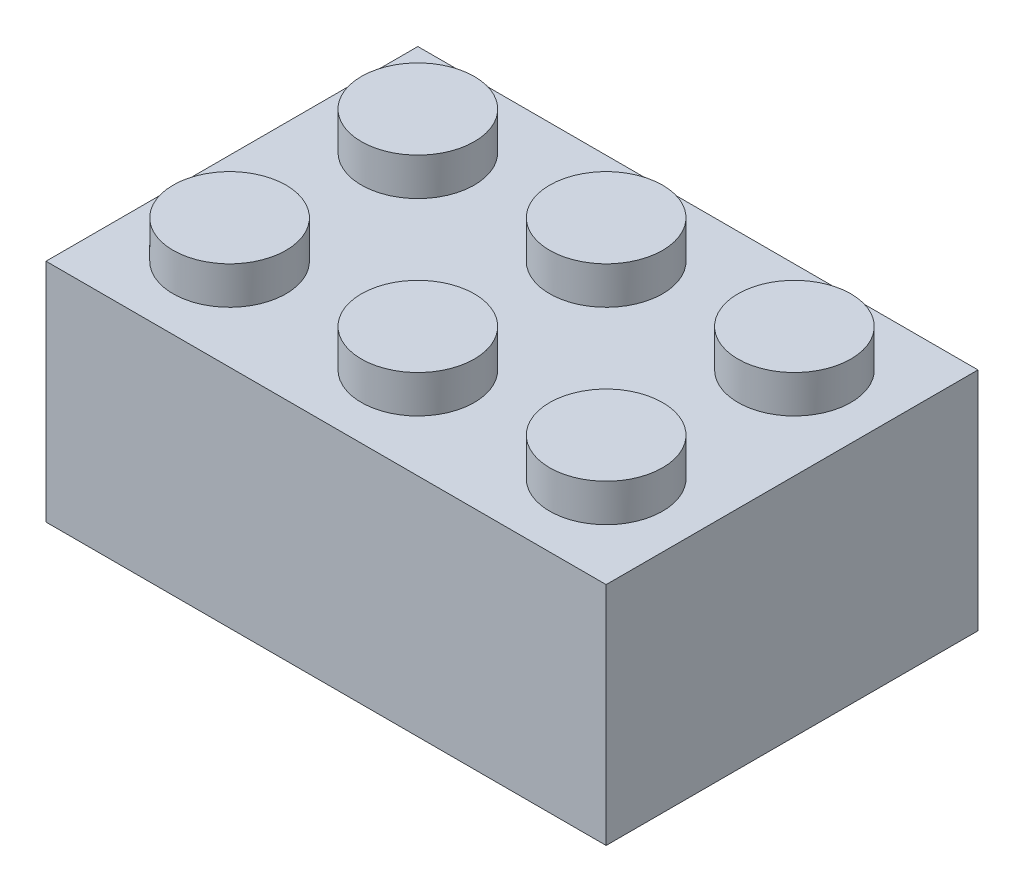
ISO-10303-21;
HEADER;
FILE_DESCRIPTION(('STEP AP214'),'2;1');
FILE_NAME('part.step','',(''),(''),'','','');
FILE_SCHEMA(('AUTOMOTIVE_DESIGN { 1 0 10303 214 1 1 1 1 }'));
ENDSEC;
DATA;
#1=APPLICATION_CONTEXT('core data for automotive mechanical design processes');
#2=APPLICATION_PROTOCOL_DEFINITION('international standard','automotive_design',2000,#1);
#3=PRODUCT_CONTEXT('',#1,'mechanical');
#4=PRODUCT('Part','Part','',(#3));
#5=PRODUCT_RELATED_PRODUCT_CATEGORY('part','',(#4));
#6=PRODUCT_DEFINITION_FORMATION('','',#4);
#7=PRODUCT_DEFINITION_CONTEXT('part definition',#1,'design');
#8=PRODUCT_DEFINITION('design','',#6,#7);
#9=PRODUCT_DEFINITION_SHAPE('','',#8);
#10=(LENGTH_UNIT() NAMED_UNIT(*) SI_UNIT(.MILLI.,.METRE.));
#11=(NAMED_UNIT(*) PLANE_ANGLE_UNIT() SI_UNIT($,.RADIAN.));
#12=(NAMED_UNIT(*) SI_UNIT($,.STERADIAN.) SOLID_ANGLE_UNIT());
#13=UNCERTAINTY_MEASURE_WITH_UNIT(LENGTH_MEASURE(1.E-05),#10,'distance_accuracy_value','');
#14=(GEOMETRIC_REPRESENTATION_CONTEXT(3) GLOBAL_UNCERTAINTY_ASSIGNED_CONTEXT((#13)) GLOBAL_UNIT_ASSIGNED_CONTEXT((#10,
#11,#12)) REPRESENTATION_CONTEXT('',''));
#15=CARTESIAN_POINT('',(0.,0.,0.));
#16=DIRECTION('',(0.,0.,1.));
#17=DIRECTION('',(1.,0.,0.));
#18=AXIS2_PLACEMENT_3D('',#15,#16,#17);
#19=CARTESIAN_POINT('',(0.,0.,-15.8));
#20=DIRECTION('',(0.,-1.,0.));
#21=DIRECTION('',(0.,0.,-1.));
#22=AXIS2_PLACEMENT_3D('',#19,#20,#21);
#23=PLANE('',#22);
#24=DIRECTION('',(1.,0.,0.));
#25=VECTOR('',#24,1.);
#26=CARTESIAN_POINT('',(0.,0.,0.));
#27=LINE('',#26,#25);
#28=CARTESIAN_POINT('',(0.,0.,0.));
#29=VERTEX_POINT('',#28);
#30=CARTESIAN_POINT('',(23.8,0.,0.));
#31=VERTEX_POINT('',#30);
#32=EDGE_CURVE('E183',#29,#31,#27,.T.);
#33=ORIENTED_EDGE('',*,*,#32,.F.);
#34=DIRECTION('',(0.,0.,1.));
#35=VECTOR('',#34,1.);
#36=CARTESIAN_POINT('',(0.,0.,-15.8));
#37=LINE('',#36,#35);
#38=CARTESIAN_POINT('',(0.,0.,-15.8));
#39=VERTEX_POINT('',#38);
#40=EDGE_CURVE('E188',#39,#29,#37,.T.);
#41=ORIENTED_EDGE('',*,*,#40,.F.);
#42=DIRECTION('',(1.,0.,0.));
#43=VECTOR('',#42,1.);
#44=CARTESIAN_POINT('',(0.,0.,-15.8));
#45=LINE('',#44,#43);
#46=CARTESIAN_POINT('',(23.8,0.,-15.8));
#47=VERTEX_POINT('',#46);
#48=EDGE_CURVE('E173',#39,#47,#45,.T.);
#49=ORIENTED_EDGE('',*,*,#48,.T.);
#50=DIRECTION('',(0.,0.,1.));
#51=VECTOR('',#50,1.);
#52=CARTESIAN_POINT('',(23.8,0.,-15.8));
#53=LINE('',#52,#51);
#54=EDGE_CURVE('E190',#47,#31,#53,.T.);
#55=ORIENTED_EDGE('',*,*,#54,.T.);
#56=EDGE_LOOP('',(#33,#41,#49,#55));
#57=FACE_BOUND('',#56,.T.);
#58=DIRECTION('',(0.,0.,1.));
#59=VECTOR('',#58,1.);
#60=CARTESIAN_POINT('',(1.2,0.,-15.8));
#61=LINE('',#60,#59);
#62=CARTESIAN_POINT('',(1.2,0.,-14.6));
#63=VERTEX_POINT('',#62);
#64=CARTESIAN_POINT('',(1.2,0.,-1.2));
#65=VERTEX_POINT('',#64);
#66=EDGE_CURVE('E156',#63,#65,#61,.T.);
#67=ORIENTED_EDGE('',*,*,#66,.T.);
#68=DIRECTION('',(1.,0.,0.));
#69=VECTOR('',#68,1.);
#70=CARTESIAN_POINT('',(0.,0.,-1.2));
#71=LINE('',#70,#69);
#72=CARTESIAN_POINT('',(22.6,0.,-1.2));
#73=VERTEX_POINT('',#72);
#74=EDGE_CURVE('E137',#65,#73,#71,.T.);
#75=ORIENTED_EDGE('',*,*,#74,.T.);
#76=DIRECTION('',(0.,0.,1.));
#77=VECTOR('',#76,1.);
#78=CARTESIAN_POINT('',(22.6,0.,-15.8));
#79=LINE('',#78,#77);
#80=CARTESIAN_POINT('',(22.6,0.,-14.6));
#81=VERTEX_POINT('',#80);
#82=EDGE_CURVE('E123',#81,#73,#79,.T.);
#83=ORIENTED_EDGE('',*,*,#82,.F.);
#84=DIRECTION('',(1.,0.,0.));
#85=VECTOR('',#84,1.);
#86=CARTESIAN_POINT('',(0.,0.,-14.6));
#87=LINE('',#86,#85);
#88=EDGE_CURVE('E51',#63,#81,#87,.T.);
#89=ORIENTED_EDGE('',*,*,#88,.F.);
#90=EDGE_LOOP('',(#67,#75,#83,#89));
#91=FACE_BOUND('',#90,.T.);
#92=ADVANCED_FACE('F36',(#57,#91),#23,.T.);
#93=CARTESIAN_POINT('',(19.9,11.2,-11.9));
#94=DIRECTION('',(0.,1.,0.));
#95=DIRECTION('',(0.,0.,1.));
#96=AXIS2_PLACEMENT_3D('',#93,#94,#95);
#97=PLANE('',#96);
#98=CARTESIAN_POINT('',(19.9,11.2,-11.9));
#99=DIRECTION('',(0.,1.,0.));
#100=DIRECTION('',(0.,0.,1.));
#101=AXIS2_PLACEMENT_3D('',#98,#99,#100);
#102=CIRCLE('',#101,2.4);
#103=CARTESIAN_POINT('',(19.9,11.2,-9.5));
#104=VERTEX_POINT('',#103);
#105=EDGE_CURVE('E221',#104,#104,#102,.T.);
#106=ORIENTED_EDGE('',*,*,#105,.T.);
#107=EDGE_LOOP('',(#106));
#108=FACE_BOUND('',#107,.T.);
#109=ADVANCED_FACE('F38',(#108),#97,.T.);
#110=CARTESIAN_POINT('',(19.9,11.2,-11.9));
#111=DIRECTION('',(0.,-1.,0.));
#112=DIRECTION('',(0.,0.,-1.));
#113=AXIS2_PLACEMENT_3D('',#110,#111,#112);
#114=CYLINDRICAL_SURFACE('',#113,2.4);
#115=ORIENTED_EDGE('',*,*,#105,.F.);
#116=EDGE_LOOP('',(#115));
#117=FACE_BOUND('',#116,.T.);
#118=CARTESIAN_POINT('',(19.9,9.6,-11.9));
#119=DIRECTION('',(0.,-1.,0.));
#120=DIRECTION('',(0.,0.,-1.));
#121=AXIS2_PLACEMENT_3D('',#118,#119,#120);
#122=CIRCLE('',#121,2.4);
#123=CARTESIAN_POINT('',(19.9,9.6,-14.3));
#124=VERTEX_POINT('',#123);
#125=EDGE_CURVE('E218',#124,#124,#122,.F.);
#126=ORIENTED_EDGE('',*,*,#125,.T.);
#127=EDGE_LOOP('',(#126));
#128=FACE_BOUND('',#127,.T.);
#129=ADVANCED_FACE('F258',(#117,#128),#114,.T.);
#130=CARTESIAN_POINT('',(11.9,11.2,-11.9));
#131=DIRECTION('',(0.,1.,0.));
#132=DIRECTION('',(0.,0.,1.));
#133=AXIS2_PLACEMENT_3D('',#130,#131,#132);
#134=PLANE('',#133);
#135=CARTESIAN_POINT('',(11.9,11.2,-11.9));
#136=DIRECTION('',(0.,1.,0.));
#137=DIRECTION('',(0.,0.,1.));
#138=AXIS2_PLACEMENT_3D('',#135,#136,#137);
#139=CIRCLE('',#138,2.4);
#140=CARTESIAN_POINT('',(11.9,11.2,-9.5));
#141=VERTEX_POINT('',#140);
#142=EDGE_CURVE('E215',#141,#141,#139,.T.);
#143=ORIENTED_EDGE('',*,*,#142,.T.);
#144=EDGE_LOOP('',(#143));
#145=FACE_BOUND('',#144,.T.);
#146=ADVANCED_FACE('F293',(#145),#134,.T.);
#147=CARTESIAN_POINT('',(11.9,11.2,-11.9));
#148=DIRECTION('',(0.,-1.,0.));
#149=DIRECTION('',(0.,0.,-1.));
#150=AXIS2_PLACEMENT_3D('',#147,#148,#149);
#151=CYLINDRICAL_SURFACE('',#150,2.4);
#152=ORIENTED_EDGE('',*,*,#142,.F.);
#153=EDGE_LOOP('',(#152));
#154=FACE_BOUND('',#153,.T.);
#155=CARTESIAN_POINT('',(11.9,9.6,-11.9));
#156=DIRECTION('',(0.,-1.,0.));
#157=DIRECTION('',(0.,0.,-1.));
#158=AXIS2_PLACEMENT_3D('',#155,#156,#157);
#159=CIRCLE('',#158,2.4);
#160=CARTESIAN_POINT('',(11.9,9.6,-14.3));
#161=VERTEX_POINT('',#160);
#162=EDGE_CURVE('E212',#161,#161,#159,.F.);
#163=ORIENTED_EDGE('',*,*,#162,.T.);
#164=EDGE_LOOP('',(#163));
#165=FACE_BOUND('',#164,.T.);
#166=ADVANCED_FACE('F289',(#154,#165),#151,.T.);
#167=CARTESIAN_POINT('',(3.9,11.2,-11.9));
#168=DIRECTION('',(0.,1.,0.));
#169=DIRECTION('',(0.,0.,1.));
#170=AXIS2_PLACEMENT_3D('',#167,#168,#169);
#171=PLANE('',#170);
#172=CARTESIAN_POINT('',(3.9,11.2,-11.9));
#173=DIRECTION('',(0.,1.,0.));
#174=DIRECTION('',(0.,0.,1.));
#175=AXIS2_PLACEMENT_3D('',#172,#173,#174);
#176=CIRCLE('',#175,2.4);
#177=CARTESIAN_POINT('',(3.9,11.2,-9.5));
#178=VERTEX_POINT('',#177);
#179=EDGE_CURVE('E209',#178,#178,#176,.T.);
#180=ORIENTED_EDGE('',*,*,#179,.T.);
#181=EDGE_LOOP('',(#180));
#182=FACE_BOUND('',#181,.T.);
#183=ADVANCED_FACE('F285',(#182),#171,.T.);
#184=CARTESIAN_POINT('',(3.9,11.2,-11.9));
#185=DIRECTION('',(0.,-1.,0.));
#186=DIRECTION('',(0.,0.,-1.));
#187=AXIS2_PLACEMENT_3D('',#184,#185,#186);
#188=CYLINDRICAL_SURFACE('',#187,2.4);
#189=ORIENTED_EDGE('',*,*,#179,.F.);
#190=EDGE_LOOP('',(#189));
#191=FACE_BOUND('',#190,.T.);
#192=CARTESIAN_POINT('',(3.9,9.6,-11.9));
#193=DIRECTION('',(0.,-1.,0.));
#194=DIRECTION('',(0.,0.,-1.));
#195=AXIS2_PLACEMENT_3D('',#192,#193,#194);
#196=CIRCLE('',#195,2.4);
#197=CARTESIAN_POINT('',(3.9,9.6,-14.3));
#198=VERTEX_POINT('',#197);
#199=EDGE_CURVE('E206',#198,#198,#196,.F.);
#200=ORIENTED_EDGE('',*,*,#199,.T.);
#201=EDGE_LOOP('',(#200));
#202=FACE_BOUND('',#201,.T.);
#203=ADVANCED_FACE('F281',(#191,#202),#188,.T.);
#204=CARTESIAN_POINT('',(19.9,11.2,-3.9));
#205=DIRECTION('',(0.,1.,0.));
#206=DIRECTION('',(0.,0.,1.));
#207=AXIS2_PLACEMENT_3D('',#204,#205,#206);
#208=PLANE('',#207);
#209=CARTESIAN_POINT('',(19.9,11.2,-3.9));
#210=DIRECTION('',(0.,1.,0.));
#211=DIRECTION('',(0.,0.,1.));
#212=AXIS2_PLACEMENT_3D('',#209,#210,#211);
#213=CIRCLE('',#212,2.4);
#214=CARTESIAN_POINT('',(19.9,11.2,-1.5));
#215=VERTEX_POINT('',#214);
#216=EDGE_CURVE('E203',#215,#215,#213,.T.);
#217=ORIENTED_EDGE('',*,*,#216,.T.);
#218=EDGE_LOOP('',(#217));
#219=FACE_BOUND('',#218,.T.);
#220=ADVANCED_FACE('F277',(#219),#208,.T.);
#221=CARTESIAN_POINT('',(19.9,11.2,-3.9));
#222=DIRECTION('',(0.,-1.,0.));
#223=DIRECTION('',(0.,0.,-1.));
#224=AXIS2_PLACEMENT_3D('',#221,#222,#223);
#225=CYLINDRICAL_SURFACE('',#224,2.4);
#226=ORIENTED_EDGE('',*,*,#216,.F.);
#227=EDGE_LOOP('',(#226));
#228=FACE_BOUND('',#227,.T.);
#229=CARTESIAN_POINT('',(19.9,9.6,-3.9));
#230=DIRECTION('',(0.,-1.,0.));
#231=DIRECTION('',(0.,0.,-1.));
#232=AXIS2_PLACEMENT_3D('',#229,#230,#231);
#233=CIRCLE('',#232,2.4);
#234=CARTESIAN_POINT('',(19.9,9.6,-6.3));
#235=VERTEX_POINT('',#234);
#236=EDGE_CURVE('E200',#235,#235,#233,.F.);
#237=ORIENTED_EDGE('',*,*,#236,.T.);
#238=EDGE_LOOP('',(#237));
#239=FACE_BOUND('',#238,.T.);
#240=ADVANCED_FACE('F273',(#228,#239),#225,.T.);
#241=CARTESIAN_POINT('',(0.,9.6,-15.8));
#242=DIRECTION('',(0.,-1.,0.));
#243=DIRECTION('',(0.,0.,-1.));
#244=AXIS2_PLACEMENT_3D('',#241,#242,#243);
#245=PLANE('',#244);
#246=CARTESIAN_POINT('',(11.9,9.6,-3.9));
#247=DIRECTION('',(0.,-1.,0.));
#248=DIRECTION('',(0.,0.,-1.));
#249=AXIS2_PLACEMENT_3D('',#246,#247,#248);
#250=CIRCLE('',#249,2.4);
#251=CARTESIAN_POINT('',(11.9,9.6,-6.3));
#252=VERTEX_POINT('',#251);
#253=EDGE_CURVE('E197',#252,#252,#250,.F.);
#254=ORIENTED_EDGE('',*,*,#253,.F.);
#255=EDGE_LOOP('',(#254));
#256=FACE_BOUND('',#255,.T.);
#257=CARTESIAN_POINT('',(3.9,9.6,-3.9));
#258=DIRECTION('',(0.,-1.,0.));
#259=DIRECTION('',(0.,0.,-1.));
#260=AXIS2_PLACEMENT_3D('',#257,#258,#259);
#261=CIRCLE('',#260,2.4);
#262=CARTESIAN_POINT('',(3.9,9.6,-6.3));
#263=VERTEX_POINT('',#262);
#264=EDGE_CURVE('E194',#263,#263,#261,.F.);
#265=ORIENTED_EDGE('',*,*,#264,.F.);
#266=EDGE_LOOP('',(#265));
#267=FACE_BOUND('',#266,.T.);
#268=DIRECTION('',(1.,0.,0.));
#269=VECTOR('',#268,1.);
#270=CARTESIAN_POINT('',(0.,9.6,0.));
#271=LINE('',#270,#269);
#272=CARTESIAN_POINT('',(0.,9.6,0.));
#273=VERTEX_POINT('',#272);
#274=CARTESIAN_POINT('',(23.8,9.6,0.));
#275=VERTEX_POINT('',#274);
#276=EDGE_CURVE('E168',#273,#275,#271,.T.);
#277=ORIENTED_EDGE('',*,*,#276,.T.);
#278=DIRECTION('',(0.,0.,1.));
#279=VECTOR('',#278,1.);
#280=CARTESIAN_POINT('',(23.8,9.6,-15.8));
#281=LINE('',#280,#279);
#282=CARTESIAN_POINT('',(23.8,9.6,-15.8));
#283=VERTEX_POINT('',#282);
#284=EDGE_CURVE('E192',#283,#275,#281,.T.);
#285=ORIENTED_EDGE('',*,*,#284,.F.);
#286=DIRECTION('',(1.,0.,0.));
#287=VECTOR('',#286,1.);
#288=CARTESIAN_POINT('',(0.,9.6,-15.8));
#289=LINE('',#288,#287);
#290=CARTESIAN_POINT('',(0.,9.6,-15.8));
#291=VERTEX_POINT('',#290);
#292=EDGE_CURVE('E86',#291,#283,#289,.T.);
#293=ORIENTED_EDGE('',*,*,#292,.F.);
#294=DIRECTION('',(0.,0.,1.));
#295=VECTOR('',#294,1.);
#296=CARTESIAN_POINT('',(0.,9.6,-15.8));
#297=LINE('',#296,#295);
#298=EDGE_CURVE('E177',#291,#273,#297,.T.);
#299=ORIENTED_EDGE('',*,*,#298,.T.);
#300=EDGE_LOOP('',(#277,#285,#293,#299));
#301=FACE_BOUND('',#300,.T.);
#302=ORIENTED_EDGE('',*,*,#236,.F.);
#303=EDGE_LOOP('',(#302));
#304=FACE_BOUND('',#303,.T.);
#305=ORIENTED_EDGE('',*,*,#199,.F.);
#306=EDGE_LOOP('',(#305));
#307=FACE_BOUND('',#306,.T.);
#308=ORIENTED_EDGE('',*,*,#162,.F.);
#309=EDGE_LOOP('',(#308));
#310=FACE_BOUND('',#309,.T.);
#311=ORIENTED_EDGE('',*,*,#125,.F.);
#312=EDGE_LOOP('',(#311));
#313=FACE_BOUND('',#312,.T.);
#314=ADVANCED_FACE('F269',(#256,#267,#301,#304,#307,#310,#313),#245,.F.);
#315=CARTESIAN_POINT('',(23.8,0.,-15.8));
#316=DIRECTION('',(1.,0.,0.));
#317=DIRECTION('',(0.,0.,-1.));
#318=AXIS2_PLACEMENT_3D('',#315,#316,#317);
#319=PLANE('',#318);
#320=DIRECTION('',(0.,1.,0.));
#321=VECTOR('',#320,1.);
#322=CARTESIAN_POINT('',(23.8,0.,0.));
#323=LINE('',#322,#321);
#324=EDGE_CURVE('E180',#31,#275,#323,.T.);
#325=ORIENTED_EDGE('',*,*,#324,.F.);
#326=ORIENTED_EDGE('',*,*,#54,.F.);
#327=DIRECTION('',(0.,1.,0.));
#328=VECTOR('',#327,1.);
#329=CARTESIAN_POINT('',(23.8,0.,-15.8));
#330=LINE('',#329,#328);
#331=EDGE_CURVE('E170',#47,#283,#330,.T.);
#332=ORIENTED_EDGE('',*,*,#331,.T.);
#333=ORIENTED_EDGE('',*,*,#284,.T.);
#334=EDGE_LOOP('',(#325,#326,#332,#333));
#335=FACE_BOUND('',#334,.T.);
#336=ADVANCED_FACE('F266',(#335),#319,.T.);
#337=CARTESIAN_POINT('',(0.,0.,-15.8));
#338=DIRECTION('',(1.,0.,0.));
#339=DIRECTION('',(0.,0.,-1.));
#340=AXIS2_PLACEMENT_3D('',#337,#338,#339);
#341=PLANE('',#340);
#342=DIRECTION('',(0.,1.,0.));
#343=VECTOR('',#342,1.);
#344=CARTESIAN_POINT('',(0.,0.,0.));
#345=LINE('',#344,#343);
#346=EDGE_CURVE('E81',#29,#273,#345,.T.);
#347=ORIENTED_EDGE('',*,*,#346,.T.);
#348=ORIENTED_EDGE('',*,*,#298,.F.);
#349=DIRECTION('',(0.,1.,0.));
#350=VECTOR('',#349,1.);
#351=CARTESIAN_POINT('',(0.,0.,-15.8));
#352=LINE('',#351,#350);
#353=EDGE_CURVE('E60',#39,#291,#352,.T.);
#354=ORIENTED_EDGE('',*,*,#353,.F.);
#355=ORIENTED_EDGE('',*,*,#40,.T.);
#356=EDGE_LOOP('',(#347,#348,#354,#355));
#357=FACE_BOUND('',#356,.T.);
#358=ADVANCED_FACE('F264',(#357),#341,.F.);
#359=CARTESIAN_POINT('',(0.,0.,-15.8));
#360=DIRECTION('',(0.,0.,1.));
#361=DIRECTION('',(1.,0.,0.));
#362=AXIS2_PLACEMENT_3D('',#359,#360,#361);
#363=PLANE('',#362);
#364=ORIENTED_EDGE('',*,*,#292,.T.);
#365=ORIENTED_EDGE('',*,*,#331,.F.);
#366=ORIENTED_EDGE('',*,*,#48,.F.);
#367=ORIENTED_EDGE('',*,*,#353,.T.);
#368=EDGE_LOOP('',(#364,#365,#366,#367));
#369=FACE_BOUND('',#368,.T.);
#370=ADVANCED_FACE('F346',(#369),#363,.F.);
#371=CARTESIAN_POINT('',(0.,0.,0.));
#372=DIRECTION('',(0.,0.,1.));
#373=DIRECTION('',(1.,0.,0.));
#374=AXIS2_PLACEMENT_3D('',#371,#372,#373);
#375=PLANE('',#374);
#376=ORIENTED_EDGE('',*,*,#276,.F.);
#377=ORIENTED_EDGE('',*,*,#346,.F.);
#378=ORIENTED_EDGE('',*,*,#32,.T.);
#379=ORIENTED_EDGE('',*,*,#324,.T.);
#380=EDGE_LOOP('',(#376,#377,#378,#379));
#381=FACE_BOUND('',#380,.T.);
#382=ADVANCED_FACE('F352',(#381),#375,.T.);
#383=CARTESIAN_POINT('',(3.9,11.2,-3.9));
#384=DIRECTION('',(0.,-1.,0.));
#385=DIRECTION('',(0.,0.,-1.));
#386=AXIS2_PLACEMENT_3D('',#383,#384,#385);
#387=CYLINDRICAL_SURFACE('',#386,2.4);
#388=CARTESIAN_POINT('',(3.9,11.2,-3.9));
#389=DIRECTION('',(0.,1.,0.));
#390=DIRECTION('',(0.,0.,1.));
#391=AXIS2_PLACEMENT_3D('',#388,#389,#390);
#392=CIRCLE('',#391,2.4);
#393=CARTESIAN_POINT('',(3.9,11.2,-1.5));
#394=VERTEX_POINT('',#393);
#395=EDGE_CURVE('E164',#394,#394,#392,.T.);
#396=ORIENTED_EDGE('',*,*,#395,.F.);
#397=EDGE_LOOP('',(#396));
#398=FACE_BOUND('',#397,.T.);
#399=ORIENTED_EDGE('',*,*,#264,.T.);
#400=EDGE_LOOP('',(#399));
#401=FACE_BOUND('',#400,.T.);
#402=ADVANCED_FACE('F359',(#398,#401),#387,.T.);
#403=CARTESIAN_POINT('',(3.9,11.2,-3.9));
#404=DIRECTION('',(0.,1.,0.));
#405=DIRECTION('',(0.,0.,1.));
#406=AXIS2_PLACEMENT_3D('',#403,#404,#405);
#407=PLANE('',#406);
#408=ORIENTED_EDGE('',*,*,#395,.T.);
#409=EDGE_LOOP('',(#408));
#410=FACE_BOUND('',#409,.T.);
#411=ADVANCED_FACE('F366',(#410),#407,.T.);
#412=CARTESIAN_POINT('',(11.9,11.2,-3.9));
#413=DIRECTION('',(0.,-1.,0.));
#414=DIRECTION('',(0.,0.,-1.));
#415=AXIS2_PLACEMENT_3D('',#412,#413,#414);
#416=CYLINDRICAL_SURFACE('',#415,2.4);
#417=CARTESIAN_POINT('',(11.9,11.2,-3.9));
#418=DIRECTION('',(0.,1.,0.));
#419=DIRECTION('',(0.,0.,1.));
#420=AXIS2_PLACEMENT_3D('',#417,#418,#419);
#421=CIRCLE('',#420,2.4);
#422=CARTESIAN_POINT('',(11.9,11.2,-1.5));
#423=VERTEX_POINT('',#422);
#424=EDGE_CURVE('E161',#423,#423,#421,.T.);
#425=ORIENTED_EDGE('',*,*,#424,.F.);
#426=EDGE_LOOP('',(#425));
#427=FACE_BOUND('',#426,.T.);
#428=ORIENTED_EDGE('',*,*,#253,.T.);
#429=EDGE_LOOP('',(#428));
#430=FACE_BOUND('',#429,.T.);
#431=ADVANCED_FACE('F374',(#427,#430),#416,.T.);
#432=CARTESIAN_POINT('',(11.9,11.2,-3.9));
#433=DIRECTION('',(0.,1.,0.));
#434=DIRECTION('',(0.,0.,1.));
#435=AXIS2_PLACEMENT_3D('',#432,#433,#434);
#436=PLANE('',#435);
#437=ORIENTED_EDGE('',*,*,#424,.T.);
#438=EDGE_LOOP('',(#437));
#439=FACE_BOUND('',#438,.T.);
#440=ADVANCED_FACE('F381',(#439),#436,.T.);
#441=CARTESIAN_POINT('',(19.9,10.,-11.9));
#442=DIRECTION('',(0.,1.,0.));
#443=DIRECTION('',(0.,0.,1.));
#444=AXIS2_PLACEMENT_3D('',#441,#442,#443);
#445=PLANE('',#444);
#446=CARTESIAN_POINT('',(19.9,10.,-11.9));
#447=DIRECTION('',(0.,1.,0.));
#448=DIRECTION('',(0.,0.,1.));
#449=AXIS2_PLACEMENT_3D('',#446,#447,#448);
#450=CIRCLE('',#449,1.2);
#451=CARTESIAN_POINT('',(19.9,10.,-10.7));
#452=VERTEX_POINT('',#451);
#453=EDGE_CURVE('E165',#452,#452,#450,.T.);
#454=ORIENTED_EDGE('',*,*,#453,.F.);
#455=EDGE_LOOP('',(#454));
#456=FACE_BOUND('',#455,.T.);
#457=ADVANCED_FACE('F389',(#456),#445,.F.);
#458=CARTESIAN_POINT('',(19.9,11.2,-11.9));
#459=DIRECTION('',(0.,-1.,0.));
#460=DIRECTION('',(0.,0.,-1.));
#461=AXIS2_PLACEMENT_3D('',#458,#459,#460);
#462=CYLINDRICAL_SURFACE('',#461,1.2);
#463=ORIENTED_EDGE('',*,*,#453,.T.);
#464=EDGE_LOOP('',(#463));
#465=FACE_BOUND('',#464,.T.);
#466=CARTESIAN_POINT('',(19.9,8.4,-11.9));
#467=DIRECTION('',(0.,-1.,0.));
#468=DIRECTION('',(0.,0.,-1.));
#469=AXIS2_PLACEMENT_3D('',#466,#467,#468);
#470=CIRCLE('',#469,1.2);
#471=CARTESIAN_POINT('',(19.9,8.4,-13.1));
#472=VERTEX_POINT('',#471);
#473=EDGE_CURVE('E672',#472,#472,#470,.F.);
#474=ORIENTED_EDGE('',*,*,#473,.F.);
#475=EDGE_LOOP('',(#474));
#476=FACE_BOUND('',#475,.T.);
#477=ADVANCED_FACE('F397',(#465,#476),#462,.F.);
#478=CARTESIAN_POINT('',(11.9,10.,-11.9));
#479=DIRECTION('',(0.,1.,0.));
#480=DIRECTION('',(0.,0.,1.));
#481=AXIS2_PLACEMENT_3D('',#478,#479,#480);
#482=PLANE('',#481);
#483=CARTESIAN_POINT('',(11.9,10.,-11.9));
#484=DIRECTION('',(0.,1.,0.));
#485=DIRECTION('',(0.,0.,1.));
#486=AXIS2_PLACEMENT_3D('',#483,#484,#485);
#487=CIRCLE('',#486,1.2);
#488=CARTESIAN_POINT('',(11.9,10.,-10.7));
#489=VERTEX_POINT('',#488);
#490=EDGE_CURVE('E675',#489,#489,#487,.T.);
#491=ORIENTED_EDGE('',*,*,#490,.F.);
#492=EDGE_LOOP('',(#491));
#493=FACE_BOUND('',#492,.T.);
#494=ADVANCED_FACE('F405',(#493),#482,.F.);
#495=CARTESIAN_POINT('',(11.9,11.2,-11.9));
#496=DIRECTION('',(0.,-1.,0.));
#497=DIRECTION('',(0.,0.,-1.));
#498=AXIS2_PLACEMENT_3D('',#495,#496,#497);
#499=CYLINDRICAL_SURFACE('',#498,1.2);
#500=ORIENTED_EDGE('',*,*,#490,.T.);
#501=EDGE_LOOP('',(#500));
#502=FACE_BOUND('',#501,.T.);
#503=CARTESIAN_POINT('',(11.9,8.4,-11.9));
#504=DIRECTION('',(0.,-1.,0.));
#505=DIRECTION('',(0.,0.,-1.));
#506=AXIS2_PLACEMENT_3D('',#503,#504,#505);
#507=CIRCLE('',#506,1.2);
#508=CARTESIAN_POINT('',(11.9,8.4,-13.1));
#509=VERTEX_POINT('',#508);
#510=EDGE_CURVE('E690',#509,#509,#507,.F.);
#511=ORIENTED_EDGE('',*,*,#510,.F.);
#512=EDGE_LOOP('',(#511));
#513=FACE_BOUND('',#512,.T.);
#514=ADVANCED_FACE('F413',(#502,#513),#499,.F.);
#515=CARTESIAN_POINT('',(3.9,10.,-11.9));
#516=DIRECTION('',(0.,1.,0.));
#517=DIRECTION('',(0.,0.,1.));
#518=AXIS2_PLACEMENT_3D('',#515,#516,#517);
#519=PLANE('',#518);
#520=CARTESIAN_POINT('',(3.9,10.,-11.9));
#521=DIRECTION('',(0.,1.,0.));
#522=DIRECTION('',(0.,0.,1.));
#523=AXIS2_PLACEMENT_3D('',#520,#521,#522);
#524=CIRCLE('',#523,1.2);
#525=CARTESIAN_POINT('',(3.9,10.,-10.7));
#526=VERTEX_POINT('',#525);
#527=EDGE_CURVE('E689',#526,#526,#524,.T.);
#528=ORIENTED_EDGE('',*,*,#527,.F.);
#529=EDGE_LOOP('',(#528));
#530=FACE_BOUND('',#529,.T.);
#531=ADVANCED_FACE('F421',(#530),#519,.F.);
#532=CARTESIAN_POINT('',(3.9,11.2,-11.9));
#533=DIRECTION('',(0.,-1.,0.));
#534=DIRECTION('',(0.,0.,-1.));
#535=AXIS2_PLACEMENT_3D('',#532,#533,#534);
#536=CYLINDRICAL_SURFACE('',#535,1.2);
#537=ORIENTED_EDGE('',*,*,#527,.T.);
#538=EDGE_LOOP('',(#537));
#539=FACE_BOUND('',#538,.T.);
#540=CARTESIAN_POINT('',(3.9,8.4,-11.9));
#541=DIRECTION('',(0.,-1.,0.));
#542=DIRECTION('',(0.,0.,-1.));
#543=AXIS2_PLACEMENT_3D('',#540,#541,#542);
#544=CIRCLE('',#543,1.2);
#545=CARTESIAN_POINT('',(3.9,8.4,-13.1));
#546=VERTEX_POINT('',#545);
#547=EDGE_CURVE('E686',#546,#546,#544,.F.);
#548=ORIENTED_EDGE('',*,*,#547,.F.);
#549=EDGE_LOOP('',(#548));
#550=FACE_BOUND('',#549,.T.);
#551=ADVANCED_FACE('F429',(#539,#550),#536,.F.);
#552=CARTESIAN_POINT('',(19.9,10.,-3.9));
#553=DIRECTION('',(0.,1.,0.));
#554=DIRECTION('',(0.,0.,1.));
#555=AXIS2_PLACEMENT_3D('',#552,#553,#554);
#556=PLANE('',#555);
#557=CARTESIAN_POINT('',(19.9,10.,-3.9));
#558=DIRECTION('',(0.,1.,0.));
#559=DIRECTION('',(0.,0.,1.));
#560=AXIS2_PLACEMENT_3D('',#557,#558,#559);
#561=CIRCLE('',#560,1.2);
#562=CARTESIAN_POINT('',(19.9,10.,-2.7));
#563=VERTEX_POINT('',#562);
#564=EDGE_CURVE('E142',#563,#563,#561,.T.);
#565=ORIENTED_EDGE('',*,*,#564,.F.);
#566=EDGE_LOOP('',(#565));
#567=FACE_BOUND('',#566,.T.);
#568=ADVANCED_FACE('F437',(#567),#556,.F.);
#569=CARTESIAN_POINT('',(19.9,11.2,-3.9));
#570=DIRECTION('',(0.,-1.,0.));
#571=DIRECTION('',(0.,0.,-1.));
#572=AXIS2_PLACEMENT_3D('',#569,#570,#571);
#573=CYLINDRICAL_SURFACE('',#572,1.2);
#574=ORIENTED_EDGE('',*,*,#564,.T.);
#575=EDGE_LOOP('',(#574));
#576=FACE_BOUND('',#575,.T.);
#577=CARTESIAN_POINT('',(19.9,8.4,-3.9));
#578=DIRECTION('',(0.,-1.,0.));
#579=DIRECTION('',(0.,0.,-1.));
#580=AXIS2_PLACEMENT_3D('',#577,#578,#579);
#581=CIRCLE('',#580,1.2);
#582=CARTESIAN_POINT('',(19.9,8.4,-5.1));
#583=VERTEX_POINT('',#582);
#584=EDGE_CURVE('E679',#583,#583,#581,.F.);
#585=ORIENTED_EDGE('',*,*,#584,.F.);
#586=EDGE_LOOP('',(#585));
#587=FACE_BOUND('',#586,.T.);
#588=ADVANCED_FACE('F247',(#576,#587),#573,.F.);
#589=CARTESIAN_POINT('',(0.,8.4,-15.8));
#590=DIRECTION('',(0.,-1.,0.));
#591=DIRECTION('',(0.,0.,-1.));
#592=AXIS2_PLACEMENT_3D('',#589,#590,#591);
#593=PLANE('',#592);
#594=CARTESIAN_POINT('',(15.9,8.4,-7.9));
#595=DIRECTION('',(0.,-1.,0.));
#596=DIRECTION('',(0.,0.,-1.));
#597=AXIS2_PLACEMENT_3D('',#594,#595,#596);
#598=CIRCLE('',#597,3.25);
#599=CARTESIAN_POINT('',(15.9,8.4,-4.65));
#600=VERTEX_POINT('',#599);
#601=EDGE_CURVE('E657',#600,#600,#598,.T.);
#602=ORIENTED_EDGE('',*,*,#601,.F.);
#603=EDGE_LOOP('',(#602));
#604=FACE_BOUND('',#603,.T.);
#605=CARTESIAN_POINT('',(7.9,8.4,-7.9));
#606=DIRECTION('',(0.,-1.,0.));
#607=DIRECTION('',(0.,0.,-1.));
#608=AXIS2_PLACEMENT_3D('',#605,#606,#607);
#609=CIRCLE('',#608,3.25);
#610=CARTESIAN_POINT('',(7.9,8.4,-11.15));
#611=VERTEX_POINT('',#610);
#612=EDGE_CURVE('E660',#611,#611,#609,.T.);
#613=ORIENTED_EDGE('',*,*,#612,.F.);
#614=EDGE_LOOP('',(#613));
#615=FACE_BOUND('',#614,.T.);
#616=CARTESIAN_POINT('',(11.9,8.4,-3.9));
#617=DIRECTION('',(0.,-1.,0.));
#618=DIRECTION('',(0.,0.,-1.));
#619=AXIS2_PLACEMENT_3D('',#616,#617,#618);
#620=CIRCLE('',#619,1.2);
#621=CARTESIAN_POINT('',(11.9,8.4,-5.1));
#622=VERTEX_POINT('',#621);
#623=EDGE_CURVE('E676',#622,#622,#620,.F.);
#624=ORIENTED_EDGE('',*,*,#623,.T.);
#625=EDGE_LOOP('',(#624));
#626=FACE_BOUND('',#625,.T.);
#627=CARTESIAN_POINT('',(3.9,8.4,-3.9));
#628=DIRECTION('',(0.,-1.,0.));
#629=DIRECTION('',(0.,0.,-1.));
#630=AXIS2_PLACEMENT_3D('',#627,#628,#629);
#631=CIRCLE('',#630,1.2);
#632=CARTESIAN_POINT('',(3.9,8.4,-5.1));
#633=VERTEX_POINT('',#632);
#634=EDGE_CURVE('E122',#633,#633,#631,.F.);
#635=ORIENTED_EDGE('',*,*,#634,.T.);
#636=EDGE_LOOP('',(#635));
#637=FACE_BOUND('',#636,.T.);
#638=DIRECTION('',(1.,0.,0.));
#639=VECTOR('',#638,1.);
#640=CARTESIAN_POINT('',(0.,8.4,-1.2));
#641=LINE('',#640,#639);
#642=CARTESIAN_POINT('',(1.2,8.4,-1.2));
#643=VERTEX_POINT('',#642);
#644=CARTESIAN_POINT('',(22.6,8.4,-1.2));
#645=VERTEX_POINT('',#644);
#646=EDGE_CURVE('E117',#643,#645,#641,.T.);
#647=ORIENTED_EDGE('',*,*,#646,.F.);
#648=DIRECTION('',(0.,0.,1.));
#649=VECTOR('',#648,1.);
#650=CARTESIAN_POINT('',(1.2,8.4,-15.8));
#651=LINE('',#650,#649);
#652=CARTESIAN_POINT('',(1.2,8.4,-14.6));
#653=VERTEX_POINT('',#652);
#654=EDGE_CURVE('E148',#653,#643,#651,.T.);
#655=ORIENTED_EDGE('',*,*,#654,.F.);
#656=DIRECTION('',(1.,0.,0.));
#657=VECTOR('',#656,1.);
#658=CARTESIAN_POINT('',(0.,8.4,-14.6));
#659=LINE('',#658,#657);
#660=CARTESIAN_POINT('',(22.6,8.4,-14.6));
#661=VERTEX_POINT('',#660);
#662=EDGE_CURVE('E119',#653,#661,#659,.T.);
#663=ORIENTED_EDGE('',*,*,#662,.T.);
#664=DIRECTION('',(0.,0.,1.));
#665=VECTOR('',#664,1.);
#666=CARTESIAN_POINT('',(22.6,8.4,-15.8));
#667=LINE('',#666,#665);
#668=EDGE_CURVE('E112',#661,#645,#667,.T.);
#669=ORIENTED_EDGE('',*,*,#668,.T.);
#670=EDGE_LOOP('',(#647,#655,#663,#669));
#671=FACE_BOUND('',#670,.T.);
#672=ORIENTED_EDGE('',*,*,#584,.T.);
#673=EDGE_LOOP('',(#672));
#674=FACE_BOUND('',#673,.T.);
#675=ORIENTED_EDGE('',*,*,#547,.T.);
#676=EDGE_LOOP('',(#675));
#677=FACE_BOUND('',#676,.T.);
#678=ORIENTED_EDGE('',*,*,#510,.T.);
#679=EDGE_LOOP('',(#678));
#680=FACE_BOUND('',#679,.T.);
#681=ORIENTED_EDGE('',*,*,#473,.T.);
#682=EDGE_LOOP('',(#681));
#683=FACE_BOUND('',#682,.T.);
#684=ADVANCED_FACE('F114',(#604,#615,#626,#637,#671,#674,#677,#680,#683),#593,.T.);
#685=CARTESIAN_POINT('',(22.6,0.,-15.8));
#686=DIRECTION('',(1.,0.,0.));
#687=DIRECTION('',(0.,0.,-1.));
#688=AXIS2_PLACEMENT_3D('',#685,#686,#687);
#689=PLANE('',#688);
#690=DIRECTION('',(0.,1.,0.));
#691=VECTOR('',#690,1.);
#692=CARTESIAN_POINT('',(22.6,0.,-1.2));
#693=LINE('',#692,#691);
#694=EDGE_CURVE('E129',#73,#645,#693,.T.);
#695=ORIENTED_EDGE('',*,*,#694,.T.);
#696=ORIENTED_EDGE('',*,*,#668,.F.);
#697=DIRECTION('',(0.,1.,0.));
#698=VECTOR('',#697,1.);
#699=CARTESIAN_POINT('',(22.6,0.,-14.6));
#700=LINE('',#699,#698);
#701=EDGE_CURVE('E144',#81,#661,#700,.T.);
#702=ORIENTED_EDGE('',*,*,#701,.F.);
#703=ORIENTED_EDGE('',*,*,#82,.T.);
#704=EDGE_LOOP('',(#695,#696,#702,#703));
#705=FACE_BOUND('',#704,.T.);
#706=ADVANCED_FACE('F135',(#705),#689,.F.);
#707=CARTESIAN_POINT('',(1.2,0.,-15.8));
#708=DIRECTION('',(1.,0.,0.));
#709=DIRECTION('',(0.,0.,-1.));
#710=AXIS2_PLACEMENT_3D('',#707,#708,#709);
#711=PLANE('',#710);
#712=DIRECTION('',(0.,1.,0.));
#713=VECTOR('',#712,1.);
#714=CARTESIAN_POINT('',(1.2,0.,-1.2));
#715=LINE('',#714,#713);
#716=EDGE_CURVE('E131',#65,#643,#715,.T.);
#717=ORIENTED_EDGE('',*,*,#716,.F.);
#718=ORIENTED_EDGE('',*,*,#66,.F.);
#719=DIRECTION('',(0.,1.,0.));
#720=VECTOR('',#719,1.);
#721=CARTESIAN_POINT('',(1.2,0.,-14.6));
#722=LINE('',#721,#720);
#723=EDGE_CURVE('E146',#63,#653,#722,.T.);
#724=ORIENTED_EDGE('',*,*,#723,.T.);
#725=ORIENTED_EDGE('',*,*,#654,.T.);
#726=EDGE_LOOP('',(#717,#718,#724,#725));
#727=FACE_BOUND('',#726,.T.);
#728=ADVANCED_FACE('F463',(#727),#711,.T.);
#729=CARTESIAN_POINT('',(0.,0.,-14.6));
#730=DIRECTION('',(0.,0.,1.));
#731=DIRECTION('',(1.,0.,0.));
#732=AXIS2_PLACEMENT_3D('',#729,#730,#731);
#733=PLANE('',#732);
#734=ORIENTED_EDGE('',*,*,#662,.F.);
#735=ORIENTED_EDGE('',*,*,#723,.F.);
#736=ORIENTED_EDGE('',*,*,#88,.T.);
#737=ORIENTED_EDGE('',*,*,#701,.T.);
#738=EDGE_LOOP('',(#734,#735,#736,#737));
#739=FACE_BOUND('',#738,.T.);
#740=ADVANCED_FACE('F469',(#739),#733,.T.);
#741=CARTESIAN_POINT('',(0.,0.,-1.2));
#742=DIRECTION('',(0.,0.,1.));
#743=DIRECTION('',(1.,0.,0.));
#744=AXIS2_PLACEMENT_3D('',#741,#742,#743);
#745=PLANE('',#744);
#746=ORIENTED_EDGE('',*,*,#646,.T.);
#747=ORIENTED_EDGE('',*,*,#694,.F.);
#748=ORIENTED_EDGE('',*,*,#74,.F.);
#749=ORIENTED_EDGE('',*,*,#716,.T.);
#750=EDGE_LOOP('',(#746,#747,#748,#749));
#751=FACE_BOUND('',#750,.T.);
#752=ADVANCED_FACE('F127',(#751),#745,.F.);
#753=CARTESIAN_POINT('',(3.9,11.2,-3.9));
#754=DIRECTION('',(0.,-1.,0.));
#755=DIRECTION('',(0.,0.,-1.));
#756=AXIS2_PLACEMENT_3D('',#753,#754,#755);
#757=CYLINDRICAL_SURFACE('',#756,1.2);
#758=CARTESIAN_POINT('',(3.9,10.,-3.9));
#759=DIRECTION('',(0.,1.,0.));
#760=DIRECTION('',(0.,0.,1.));
#761=AXIS2_PLACEMENT_3D('',#758,#759,#760);
#762=CIRCLE('',#761,1.2);
#763=CARTESIAN_POINT('',(3.9,10.,-2.7));
#764=VERTEX_POINT('',#763);
#765=EDGE_CURVE('E133',#764,#764,#762,.T.);
#766=ORIENTED_EDGE('',*,*,#765,.T.);
#767=EDGE_LOOP('',(#766));
#768=FACE_BOUND('',#767,.T.);
#769=ORIENTED_EDGE('',*,*,#634,.F.);
#770=EDGE_LOOP('',(#769));
#771=FACE_BOUND('',#770,.T.);
#772=ADVANCED_FACE('F483',(#768,#771),#757,.F.);
#773=CARTESIAN_POINT('',(3.9,10.,-3.9));
#774=DIRECTION('',(0.,1.,0.));
#775=DIRECTION('',(0.,0.,1.));
#776=AXIS2_PLACEMENT_3D('',#773,#774,#775);
#777=PLANE('',#776);
#778=ORIENTED_EDGE('',*,*,#765,.F.);
#779=EDGE_LOOP('',(#778));
#780=FACE_BOUND('',#779,.T.);
#781=ADVANCED_FACE('F490',(#780),#777,.F.);
#782=CARTESIAN_POINT('',(11.9,11.2,-3.9));
#783=DIRECTION('',(0.,-1.,0.));
#784=DIRECTION('',(0.,0.,-1.));
#785=AXIS2_PLACEMENT_3D('',#782,#783,#784);
#786=CYLINDRICAL_SURFACE('',#785,1.2);
#787=CARTESIAN_POINT('',(11.9,10.,-3.9));
#788=DIRECTION('',(0.,1.,0.));
#789=DIRECTION('',(0.,0.,1.));
#790=AXIS2_PLACEMENT_3D('',#787,#788,#789);
#791=CIRCLE('',#790,1.2);
#792=CARTESIAN_POINT('',(11.9,10.,-2.7));
#793=VERTEX_POINT('',#792);
#794=EDGE_CURVE('E152',#793,#793,#791,.T.);
#795=ORIENTED_EDGE('',*,*,#794,.T.);
#796=EDGE_LOOP('',(#795));
#797=FACE_BOUND('',#796,.T.);
#798=ORIENTED_EDGE('',*,*,#623,.F.);
#799=EDGE_LOOP('',(#798));
#800=FACE_BOUND('',#799,.T.);
#801=ADVANCED_FACE('F498',(#797,#800),#786,.F.);
#802=CARTESIAN_POINT('',(11.9,10.,-3.9));
#803=DIRECTION('',(0.,1.,0.));
#804=DIRECTION('',(0.,0.,1.));
#805=AXIS2_PLACEMENT_3D('',#802,#803,#804);
#806=PLANE('',#805);
#807=ORIENTED_EDGE('',*,*,#794,.F.);
#808=EDGE_LOOP('',(#807));
#809=FACE_BOUND('',#808,.T.);
#810=ADVANCED_FACE('F506',(#809),#806,.F.);
#811=CARTESIAN_POINT('',(7.9,-9.19238815542512,-7.9));
#812=DIRECTION('',(0.,1.,0.));
#813=DIRECTION('',(0.,0.,1.));
#814=AXIS2_PLACEMENT_3D('',#811,#812,#813);
#815=CYLINDRICAL_SURFACE('',#814,3.25);
#816=ORIENTED_EDGE('',*,*,#612,.T.);
#817=EDGE_LOOP('',(#816));
#818=FACE_BOUND('',#817,.T.);
#819=CARTESIAN_POINT('',(7.9,0.200000000000001,-7.9));
#820=DIRECTION('',(0.,-1.,0.));
#821=DIRECTION('',(0.,0.,-1.));
#822=AXIS2_PLACEMENT_3D('',#819,#820,#821);
#823=CIRCLE('',#822,3.25);
#824=CARTESIAN_POINT('',(7.9,0.200000000000001,-11.15));
#825=VERTEX_POINT('',#824);
#826=EDGE_CURVE('E155',#825,#825,#823,.T.);
#827=ORIENTED_EDGE('',*,*,#826,.F.);
#828=EDGE_LOOP('',(#827));
#829=FACE_BOUND('',#828,.T.);
#830=ADVANCED_FACE('F514',(#818,#829),#815,.T.);
#831=CARTESIAN_POINT('',(7.9,-9.19238815542512,-7.9));
#832=DIRECTION('',(0.,1.,0.));
#833=DIRECTION('',(0.,0.,1.));
#834=AXIS2_PLACEMENT_3D('',#831,#832,#833);
#835=CYLINDRICAL_SURFACE('',#834,2.4);
#836=CARTESIAN_POINT('',(7.9,8.4,-7.9));
#837=DIRECTION('',(0.,-1.,0.));
#838=DIRECTION('',(0.,0.,-1.));
#839=AXIS2_PLACEMENT_3D('',#836,#837,#838);
#840=CIRCLE('',#839,2.4);
#841=CARTESIAN_POINT('',(7.9,8.4,-10.3));
#842=VERTEX_POINT('',#841);
#843=EDGE_CURVE('E44',#842,#842,#840,.F.);
#844=ORIENTED_EDGE('',*,*,#843,.T.);
#845=EDGE_LOOP('',(#844));
#846=FACE_BOUND('',#845,.T.);
#847=CARTESIAN_POINT('',(7.9,0.200000000000001,-7.9));
#848=DIRECTION('',(0.,-1.,0.));
#849=DIRECTION('',(0.,0.,-1.));
#850=AXIS2_PLACEMENT_3D('',#847,#848,#849);
#851=CIRCLE('',#850,2.4);
#852=CARTESIAN_POINT('',(7.9,0.200000000000001,-10.3));
#853=VERTEX_POINT('',#852);
#854=EDGE_CURVE('E656',#853,#853,#851,.T.);
#855=ORIENTED_EDGE('',*,*,#854,.T.);
#856=EDGE_LOOP('',(#855));
#857=FACE_BOUND('',#856,.T.);
#858=ADVANCED_FACE('F226',(#846,#857),#835,.F.);
#859=CARTESIAN_POINT('',(0.,0.2,-15.8));
#860=DIRECTION('',(0.,-1.,0.));
#861=DIRECTION('',(0.,0.,-1.));
#862=AXIS2_PLACEMENT_3D('',#859,#860,#861);
#863=PLANE('',#862);
#864=ORIENTED_EDGE('',*,*,#854,.F.);
#865=EDGE_LOOP('',(#864));
#866=FACE_BOUND('',#865,.T.);
#867=ORIENTED_EDGE('',*,*,#826,.T.);
#868=EDGE_LOOP('',(#867));
#869=FACE_BOUND('',#868,.T.);
#870=ADVANCED_FACE('F232',(#866,#869),#863,.T.);
#871=ORIENTED_EDGE('',*,*,#843,.F.);
#872=EDGE_LOOP('',(#871));
#873=FACE_BOUND('',#872,.T.);
#874=ADVANCED_FACE('F229',(#873),#593,.T.);
#875=CARTESIAN_POINT('',(15.9,-9.19238815542511,-7.9));
#876=DIRECTION('',(0.,1.,0.));
#877=DIRECTION('',(0.,0.,1.));
#878=AXIS2_PLACEMENT_3D('',#875,#876,#877);
#879=CYLINDRICAL_SURFACE('',#878,3.25);
#880=CARTESIAN_POINT('',(15.9,0.200000000000001,-7.9));
#881=DIRECTION('',(0.,-1.,0.));
#882=DIRECTION('',(0.,0.,-1.));
#883=AXIS2_PLACEMENT_3D('',#880,#881,#882);
#884=CIRCLE('',#883,3.25);
#885=CARTESIAN_POINT('',(15.9,0.200000000000002,-4.65));
#886=VERTEX_POINT('',#885);
#887=EDGE_CURVE('E654',#886,#886,#884,.T.);
#888=CARTESIAN_POINT('',(15.9,8.4,-4.65));
#889=CARTESIAN_POINT('',(15.9,8.31458333333333,-4.65));
#890=CARTESIAN_POINT('',(15.9,8.22916666666667,-4.65));
#891=CARTESIAN_POINT('',(15.9,8.05833333333333,-4.65));
#892=CARTESIAN_POINT('',(15.9,7.97291666666667,-4.65));
#893=CARTESIAN_POINT('',(15.9,7.80208333333333,-4.65));
#894=CARTESIAN_POINT('',(15.9,7.71666666666667,-4.65));
#895=CARTESIAN_POINT('',(15.9,7.54583333333333,-4.65));
#896=CARTESIAN_POINT('',(15.9,7.46041666666667,-4.65));
#897=CARTESIAN_POINT('',(15.9,7.28958333333333,-4.65));
#898=CARTESIAN_POINT('',(15.9,7.20416666666667,-4.65));
#899=CARTESIAN_POINT('',(15.9,7.03333333333333,-4.65));
#900=CARTESIAN_POINT('',(15.9,6.94791666666667,-4.65));
#901=CARTESIAN_POINT('',(15.9,6.77708333333333,-4.65));
#902=CARTESIAN_POINT('',(15.9,6.69166666666667,-4.65));
#903=CARTESIAN_POINT('',(15.9,6.52083333333333,-4.65));
#904=CARTESIAN_POINT('',(15.9,6.43541666666667,-4.65));
#905=CARTESIAN_POINT('',(15.9,6.26458333333333,-4.65));
#906=CARTESIAN_POINT('',(15.9,6.17916666666667,-4.65));
#907=CARTESIAN_POINT('',(15.9,6.00833333333334,-4.65));
#908=CARTESIAN_POINT('',(15.9,5.92291666666667,-4.65));
#909=CARTESIAN_POINT('',(15.9,5.75208333333334,-4.65));
#910=CARTESIAN_POINT('',(15.9,5.66666666666667,-4.65));
#911=CARTESIAN_POINT('',(15.9,5.49583333333333,-4.65));
#912=CARTESIAN_POINT('',(15.9,5.41041666666667,-4.65));
#913=CARTESIAN_POINT('',(15.9,5.23958333333333,-4.65));
#914=CARTESIAN_POINT('',(15.9,5.15416666666667,-4.65));
#915=CARTESIAN_POINT('',(15.9,4.98333333333334,-4.65));
#916=CARTESIAN_POINT('',(15.9,4.89791666666667,-4.65));
#917=CARTESIAN_POINT('',(15.9,4.72708333333333,-4.65));
#918=CARTESIAN_POINT('',(15.9,4.64166666666667,-4.65));
#919=CARTESIAN_POINT('',(15.9,4.47083333333333,-4.65));
#920=CARTESIAN_POINT('',(15.9,4.38541666666667,-4.65));
#921=CARTESIAN_POINT('',(15.9,4.21458333333334,-4.65));
#922=CARTESIAN_POINT('',(15.9,4.12916666666667,-4.65));
#923=CARTESIAN_POINT('',(15.9,3.95833333333334,-4.65));
#924=CARTESIAN_POINT('',(15.9,3.87291666666667,-4.65));
#925=CARTESIAN_POINT('',(15.9,3.70208333333334,-4.65));
#926=CARTESIAN_POINT('',(15.9,3.61666666666667,-4.65));
#927=CARTESIAN_POINT('',(15.9,3.44583333333334,-4.65));
#928=CARTESIAN_POINT('',(15.9,3.36041666666667,-4.65));
#929=CARTESIAN_POINT('',(15.9,3.18958333333334,-4.65));
#930=CARTESIAN_POINT('',(15.9,3.10416666666667,-4.65));
#931=CARTESIAN_POINT('',(15.9,2.93333333333333,-4.65));
#932=CARTESIAN_POINT('',(15.9,2.84791666666667,-4.65));
#933=CARTESIAN_POINT('',(15.9,2.67708333333333,-4.65));
#934=CARTESIAN_POINT('',(15.9,2.59166666666667,-4.65));
#935=CARTESIAN_POINT('',(15.9,2.42083333333334,-4.65));
#936=CARTESIAN_POINT('',(15.9,2.33541666666667,-4.65));
#937=CARTESIAN_POINT('',(15.9,2.16458333333334,-4.65));
#938=CARTESIAN_POINT('',(15.9,2.07916666666667,-4.65));
#939=CARTESIAN_POINT('',(15.9,1.90833333333334,-4.65));
#940=CARTESIAN_POINT('',(15.9,1.82291666666667,-4.65));
#941=CARTESIAN_POINT('',(15.9,1.65208333333334,-4.65));
#942=CARTESIAN_POINT('',(15.9,1.56666666666667,-4.65));
#943=CARTESIAN_POINT('',(15.9,1.39583333333334,-4.65));
#944=CARTESIAN_POINT('',(15.9,1.31041666666667,-4.65));
#945=CARTESIAN_POINT('',(15.9,1.13958333333334,-4.65));
#946=CARTESIAN_POINT('',(15.9,1.05416666666667,-4.65));
#947=CARTESIAN_POINT('',(15.9,0.883333333333336,-4.65));
#948=CARTESIAN_POINT('',(15.9,0.797916666666668,-4.65));
#949=CARTESIAN_POINT('',(15.9,0.627083333333335,-4.65));
#950=CARTESIAN_POINT('',(15.9,0.541666666666668,-4.65));
#951=CARTESIAN_POINT('',(15.9,0.370833333333335,-4.65));
#952=CARTESIAN_POINT('',(15.9,0.285416666666669,-4.65));
#953=CARTESIAN_POINT('',(15.9,0.200000000000002,-4.65));
#954=B_SPLINE_CURVE_WITH_KNOTS('',3,(#888,#889,#890,#891,#892,#893,#894,#895,#896,#897,#898,
#899,#900,#901,#902,#903,#904,#905,#906,#907,#908,#909,#910,#911,#912,#913,#914,#915,#916,#917,
#918,#919,#920,#921,#922,#923,#924,#925,#926,#927,#928,#929,#930,#931,#932,#933,#934,#935,#936,
#937,#938,#939,#940,#941,#942,#943,#944,#945,#946,#947,#948,#949,#950,#951,#952,#953),
.UNSPECIFIED.,.F.,.F.,(4,2,2,2,2,2,2,2,2,2,2,2,2,2,2,2,2,2,2,2,2,2,2,2,2,2,2,2,2,2,2,2,4),(0.,
0.25625,0.512499999999999,0.768749999999999,1.025,1.28125,1.5375,1.79375,2.05,2.30625,2.5625,
2.81875,3.075,3.33125,3.5875,3.84375,4.1,4.35625,4.6125,4.86875,5.125,5.38125,5.6375,5.89375,
6.15,6.40625,6.6625,6.91875,7.175,7.43125,7.6875,7.94375,8.2),.UNSPECIFIED.);
#955=EDGE_CURVE('BSEAM231',#600,#886,#954,.T.);
#956=ORIENTED_EDGE('',*,*,#601,.T.);
#957=ORIENTED_EDGE('',*,*,#887,.F.);
#958=ORIENTED_EDGE('',*,*,#955,.T.);
#959=ORIENTED_EDGE('',*,*,#955,.F.);
#960=EDGE_LOOP('',(#956,#958,#957,#959));
#961=FACE_BOUND('',#960,.T.);
#962=ADVANCED_FACE('F231',(#961),#879,.T.);
#963=CARTESIAN_POINT('',(15.9,-9.19238815542511,-7.9));
#964=DIRECTION('',(0.,1.,0.));
#965=DIRECTION('',(0.,0.,1.));
#966=AXIS2_PLACEMENT_3D('',#963,#964,#965);
#967=CYLINDRICAL_SURFACE('',#966,2.4);
#968=CARTESIAN_POINT('',(15.9,8.4,-7.9));
#969=DIRECTION('',(0.,-1.,0.));
#970=DIRECTION('',(0.,0.,-1.));
#971=AXIS2_PLACEMENT_3D('',#968,#969,#970);
#972=CIRCLE('',#971,2.4);
#973=CARTESIAN_POINT('',(15.9,8.4,-5.5));
#974=VERTEX_POINT('',#973);
#975=EDGE_CURVE('E12',#974,#974,#972,.F.);
#976=CARTESIAN_POINT('',(15.9,0.200000000000001,-7.9));
#977=DIRECTION('',(0.,-1.,0.));
#978=DIRECTION('',(0.,0.,-1.));
#979=AXIS2_PLACEMENT_3D('',#976,#977,#978);
#980=CIRCLE('',#979,2.4);
#981=CARTESIAN_POINT('',(15.9,0.200000000000002,-5.5));
#982=VERTEX_POINT('',#981);
#983=EDGE_CURVE('E651',#982,#982,#980,.T.);
#984=CARTESIAN_POINT('',(15.9,8.4,-5.5));
#985=CARTESIAN_POINT('',(15.9,8.31458333333333,-5.5));
#986=CARTESIAN_POINT('',(15.9,8.22916666666667,-5.5));
#987=CARTESIAN_POINT('',(15.9,8.05833333333333,-5.5));
#988=CARTESIAN_POINT('',(15.9,7.97291666666667,-5.5));
#989=CARTESIAN_POINT('',(15.9,7.80208333333333,-5.5));
#990=CARTESIAN_POINT('',(15.9,7.71666666666667,-5.5));
#991=CARTESIAN_POINT('',(15.9,7.54583333333333,-5.5));
#992=CARTESIAN_POINT('',(15.9,7.46041666666667,-5.5));
#993=CARTESIAN_POINT('',(15.9,7.28958333333333,-5.5));
#994=CARTESIAN_POINT('',(15.9,7.20416666666667,-5.5));
#995=CARTESIAN_POINT('',(15.9,7.03333333333333,-5.5));
#996=CARTESIAN_POINT('',(15.9,6.94791666666667,-5.5));
#997=CARTESIAN_POINT('',(15.9,6.77708333333333,-5.5));
#998=CARTESIAN_POINT('',(15.9,6.69166666666667,-5.5));
#999=CARTESIAN_POINT('',(15.9,6.52083333333333,-5.5));
#1000=CARTESIAN_POINT('',(15.9,6.43541666666667,-5.5));
#1001=CARTESIAN_POINT('',(15.9,6.26458333333333,-5.5));
#1002=CARTESIAN_POINT('',(15.9,6.17916666666667,-5.5));
#1003=CARTESIAN_POINT('',(15.9,6.00833333333334,-5.5));
#1004=CARTESIAN_POINT('',(15.9,5.92291666666667,-5.5));
#1005=CARTESIAN_POINT('',(15.9,5.75208333333334,-5.5));
#1006=CARTESIAN_POINT('',(15.9,5.66666666666667,-5.5));
#1007=CARTESIAN_POINT('',(15.9,5.49583333333333,-5.5));
#1008=CARTESIAN_POINT('',(15.9,5.41041666666667,-5.5));
#1009=CARTESIAN_POINT('',(15.9,5.23958333333333,-5.5));
#1010=CARTESIAN_POINT('',(15.9,5.15416666666667,-5.5));
#1011=CARTESIAN_POINT('',(15.9,4.98333333333334,-5.5));
#1012=CARTESIAN_POINT('',(15.9,4.89791666666667,-5.5));
#1013=CARTESIAN_POINT('',(15.9,4.72708333333333,-5.5));
#1014=CARTESIAN_POINT('',(15.9,4.64166666666667,-5.5));
#1015=CARTESIAN_POINT('',(15.9,4.47083333333333,-5.5));
#1016=CARTESIAN_POINT('',(15.9,4.38541666666667,-5.5));
#1017=CARTESIAN_POINT('',(15.9,4.21458333333334,-5.5));
#1018=CARTESIAN_POINT('',(15.9,4.12916666666667,-5.5));
#1019=CARTESIAN_POINT('',(15.9,3.95833333333334,-5.5));
#1020=CARTESIAN_POINT('',(15.9,3.87291666666667,-5.5));
#1021=CARTESIAN_POINT('',(15.9,3.70208333333334,-5.5));
#1022=CARTESIAN_POINT('',(15.9,3.61666666666667,-5.5));
#1023=CARTESIAN_POINT('',(15.9,3.44583333333334,-5.5));
#1024=CARTESIAN_POINT('',(15.9,3.36041666666667,-5.5));
#1025=CARTESIAN_POINT('',(15.9,3.18958333333334,-5.5));
#1026=CARTESIAN_POINT('',(15.9,3.10416666666667,-5.5));
#1027=CARTESIAN_POINT('',(15.9,2.93333333333333,-5.5));
#1028=CARTESIAN_POINT('',(15.9,2.84791666666667,-5.5));
#1029=CARTESIAN_POINT('',(15.9,2.67708333333333,-5.5));
#1030=CARTESIAN_POINT('',(15.9,2.59166666666667,-5.5));
#1031=CARTESIAN_POINT('',(15.9,2.42083333333334,-5.5));
#1032=CARTESIAN_POINT('',(15.9,2.33541666666667,-5.5));
#1033=CARTESIAN_POINT('',(15.9,2.16458333333334,-5.5));
#1034=CARTESIAN_POINT('',(15.9,2.07916666666667,-5.5));
#1035=CARTESIAN_POINT('',(15.9,1.90833333333334,-5.5));
#1036=CARTESIAN_POINT('',(15.9,1.82291666666667,-5.5));
#1037=CARTESIAN_POINT('',(15.9,1.65208333333334,-5.5));
#1038=CARTESIAN_POINT('',(15.9,1.56666666666667,-5.5));
#1039=CARTESIAN_POINT('',(15.9,1.39583333333334,-5.5));
#1040=CARTESIAN_POINT('',(15.9,1.31041666666667,-5.5));
#1041=CARTESIAN_POINT('',(15.9,1.13958333333334,-5.5));
#1042=CARTESIAN_POINT('',(15.9,1.05416666666667,-5.5));
#1043=CARTESIAN_POINT('',(15.9,0.883333333333336,-5.5));
#1044=CARTESIAN_POINT('',(15.9,0.797916666666668,-5.5));
#1045=CARTESIAN_POINT('',(15.9,0.627083333333335,-5.5));
#1046=CARTESIAN_POINT('',(15.9,0.541666666666668,-5.5));
#1047=CARTESIAN_POINT('',(15.9,0.370833333333335,-5.5));
#1048=CARTESIAN_POINT('',(15.9,0.285416666666669,-5.5));
#1049=CARTESIAN_POINT('',(15.9,0.200000000000002,-5.5));
#1050=B_SPLINE_CURVE_WITH_KNOTS('',3,(#984,#985,#986,#987,#988,#989,#990,#991,#992,#993,#994,
#995,#996,#997,#998,#999,#1000,#1001,#1002,#1003,#1004,#1005,#1006,#1007,#1008,#1009,#1010,
#1011,#1012,#1013,#1014,#1015,#1016,#1017,#1018,#1019,#1020,#1021,#1022,#1023,#1024,#1025,#1026,
#1027,#1028,#1029,#1030,#1031,#1032,#1033,#1034,#1035,#1036,#1037,#1038,#1039,#1040,#1041,#1042,
#1043,#1044,#1045,#1046,#1047,#1048,#1049),.UNSPECIFIED.,.F.,.F.,(4,2,2,2,2,2,2,2,2,2,2,2,2,2,2,
2,2,2,2,2,2,2,2,2,2,2,2,2,2,2,2,2,4),(0.,0.25625,0.512499999999999,0.768749999999999,1.025,
1.28125,1.5375,1.79375,2.05,2.30625,2.5625,2.81875,3.075,3.33125,3.5875,3.84375,4.1,4.35625,
4.6125,4.86875,5.125,5.38125,5.6375,5.89375,6.15,6.40625,6.6625,6.91875,7.175,7.43125,7.6875,
7.94375,8.2),.UNSPECIFIED.);
#1051=EDGE_CURVE('BSEAM239',#974,#982,#1050,.T.);
#1052=ORIENTED_EDGE('',*,*,#975,.T.);
#1053=ORIENTED_EDGE('',*,*,#983,.T.);
#1054=ORIENTED_EDGE('',*,*,#1051,.T.);
#1055=ORIENTED_EDGE('',*,*,#1051,.F.);
#1056=EDGE_LOOP('',(#1052,#1054,#1053,#1055));
#1057=FACE_BOUND('',#1056,.T.);
#1058=ADVANCED_FACE('F239',(#1057),#967,.F.);
#1059=CARTESIAN_POINT('',(0.,0.2,-15.8));
#1060=DIRECTION('',(0.,-1.,0.));
#1061=DIRECTION('',(0.,0.,-1.));
#1062=AXIS2_PLACEMENT_3D('',#1059,#1060,#1061);
#1063=PLANE('',#1062);
#1064=ORIENTED_EDGE('',*,*,#983,.F.);
#1065=EDGE_LOOP('',(#1064));
#1066=FACE_BOUND('',#1065,.T.);
#1067=ORIENTED_EDGE('',*,*,#887,.T.);
#1068=EDGE_LOOP('',(#1067));
#1069=FACE_BOUND('',#1068,.T.);
#1070=ADVANCED_FACE('F250',(#1066,#1069),#1063,.T.);
#1071=ORIENTED_EDGE('',*,*,#975,.F.);
#1072=EDGE_LOOP('',(#1071));
#1073=FACE_BOUND('',#1072,.T.);
#1074=ADVANCED_FACE('F234',(#1073),#593,.T.);
#1075=CLOSED_SHELL('',(#92,#109,#129,#146,#166,#183,#203,#220,#240,#314,#336,#358,#370,#382,
#402,#411,#431,#440,#457,#477,#494,#514,#531,#551,#568,#588,#684,#706,#728,#740,#752,#772,#781,
#801,#810,#830,#858,#870,#874,#962,#1058,#1070,#1074));
#1076=MANIFOLD_SOLID_BREP('B2',#1075);
#1077=ADVANCED_BREP_SHAPE_REPRESENTATION('',(#18,#1076),#14);
#1078=SHAPE_DEFINITION_REPRESENTATION(#9,#1077);
ENDSEC;
END-ISO-10303-21;
